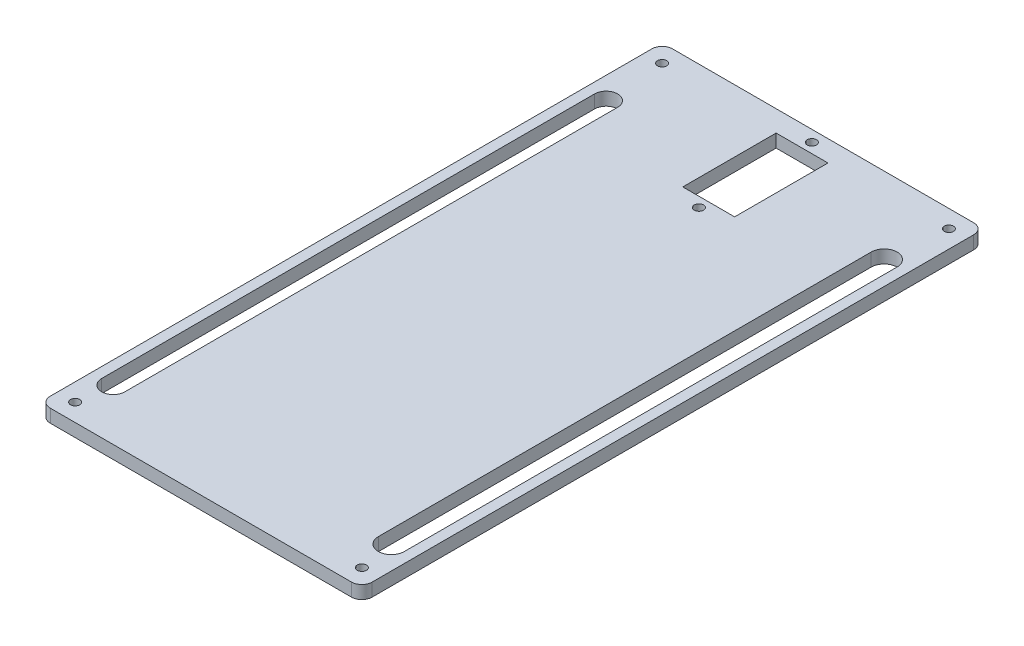
ISO-10303-21;
HEADER;
FILE_DESCRIPTION(('STEP AP214'),'2;1');
FILE_NAME('part.step','',(''),(''),'','','');
FILE_SCHEMA(('AUTOMOTIVE_DESIGN { 1 0 10303 214 1 1 1 1 }'));
ENDSEC;
DATA;
#1=APPLICATION_CONTEXT('core data for automotive mechanical design processes');
#2=APPLICATION_PROTOCOL_DEFINITION('international standard','automotive_design',2000,#1);
#3=PRODUCT_CONTEXT('',#1,'mechanical');
#4=PRODUCT('Part','Part','',(#3));
#5=PRODUCT_RELATED_PRODUCT_CATEGORY('part','',(#4));
#6=PRODUCT_DEFINITION_FORMATION('','',#4);
#7=PRODUCT_DEFINITION_CONTEXT('part definition',#1,'design');
#8=PRODUCT_DEFINITION('design','',#6,#7);
#9=PRODUCT_DEFINITION_SHAPE('','',#8);
#10=(LENGTH_UNIT() NAMED_UNIT(*) SI_UNIT(.MILLI.,.METRE.));
#11=(NAMED_UNIT(*) PLANE_ANGLE_UNIT() SI_UNIT($,.RADIAN.));
#12=(NAMED_UNIT(*) SI_UNIT($,.STERADIAN.) SOLID_ANGLE_UNIT());
#13=UNCERTAINTY_MEASURE_WITH_UNIT(LENGTH_MEASURE(1.E-05),#10,'distance_accuracy_value','');
#14=(GEOMETRIC_REPRESENTATION_CONTEXT(3) GLOBAL_UNCERTAINTY_ASSIGNED_CONTEXT((#13)) GLOBAL_UNIT_ASSIGNED_CONTEXT((#10,
#11,#12)) REPRESENTATION_CONTEXT('',''));
#15=CARTESIAN_POINT('',(0.,0.,0.));
#16=DIRECTION('',(0.,0.,1.));
#17=DIRECTION('',(1.,0.,0.));
#18=AXIS2_PLACEMENT_3D('',#15,#16,#17);
#19=CARTESIAN_POINT('',(-44.45,0.,152.4));
#20=DIRECTION('',(1.,0.,0.));
#21=DIRECTION('',(0.,0.,-1.));
#22=AXIS2_PLACEMENT_3D('',#19,#20,#21);
#23=PLANE('',#22);
#24=DIRECTION('',(0.,0.,-1.));
#25=VECTOR('',#24,1.);
#26=CARTESIAN_POINT('',(-44.45,-3.2004,152.4));
#27=LINE('',#26,#25);
#28=CARTESIAN_POINT('',(-44.45,-3.2004,149.86));
#29=VERTEX_POINT('',#28);
#30=CARTESIAN_POINT('',(-44.45,-3.2004,2.54000000000004));
#31=VERTEX_POINT('',#30);
#32=EDGE_CURVE('E332',#29,#31,#27,.T.);
#33=ORIENTED_EDGE('',*,*,#32,.F.);
#34=DIRECTION('',(0.,-1.,0.));
#35=VECTOR('',#34,1.);
#36=CARTESIAN_POINT('',(-44.45,0.,149.86));
#37=LINE('',#36,#35);
#38=CARTESIAN_POINT('',(-44.45,0.,149.86));
#39=VERTEX_POINT('',#38);
#40=EDGE_CURVE('E59',#29,#39,#37,.F.);
#41=ORIENTED_EDGE('',*,*,#40,.T.);
#42=DIRECTION('',(0.,0.,-1.));
#43=VECTOR('',#42,1.);
#44=CARTESIAN_POINT('',(-44.45,0.,152.4));
#45=LINE('',#44,#43);
#46=CARTESIAN_POINT('',(-44.45,0.,2.54000000000004));
#47=VERTEX_POINT('',#46);
#48=EDGE_CURVE('E320',#39,#47,#45,.T.);
#49=ORIENTED_EDGE('',*,*,#48,.T.);
#50=DIRECTION('',(0.,-1.,0.));
#51=VECTOR('',#50,1.);
#52=CARTESIAN_POINT('',(-44.45,0.,2.53999999999999));
#53=LINE('',#52,#51);
#54=EDGE_CURVE('E360',#47,#31,#53,.T.);
#55=ORIENTED_EDGE('',*,*,#54,.T.);
#56=EDGE_LOOP('',(#33,#41,#49,#55));
#57=FACE_BOUND('',#56,.T.);
#58=ADVANCED_FACE('F37',(#57),#23,.F.);
#59=CARTESIAN_POINT('',(-44.45,-3.2004,152.4));
#60=DIRECTION('',(0.,1.,0.));
#61=DIRECTION('',(-1.,0.,0.));
#62=AXIS2_PLACEMENT_3D('',#59,#60,#61);
#63=PLANE('',#62);
#64=CARTESIAN_POINT('',(-5.02776489999999,-3.2004,2.76528759088731));
#65=DIRECTION('',(0.,-1.,0.));
#66=DIRECTION('',(0.,0.,-1.));
#67=AXIS2_PLACEMENT_3D('',#64,#65,#66);
#68=CIRCLE('',#67,1.1303);
#69=CARTESIAN_POINT('',(-5.02776489999999,-3.2004,1.63498759088731));
#70=VERTEX_POINT('',#69);
#71=EDGE_CURVE('E660',#70,#70,#68,.T.);
#72=ORIENTED_EDGE('',*,*,#71,.F.);
#73=EDGE_LOOP('',(#72));
#74=FACE_BOUND('',#73,.T.);
#75=CARTESIAN_POINT('',(-5.02776490000001,-3.2004,30.4258875908873));
#76=DIRECTION('',(0.,-1.,0.));
#77=DIRECTION('',(0.,0.,-1.));
#78=AXIS2_PLACEMENT_3D('',#75,#76,#77);
#79=CIRCLE('',#78,1.13030000000001);
#80=CARTESIAN_POINT('',(-5.02776490000001,-3.2004,29.2955875908873));
#81=VERTEX_POINT('',#80);
#82=EDGE_CURVE('E206',#81,#81,#79,.T.);
#83=ORIENTED_EDGE('',*,*,#82,.F.);
#84=EDGE_LOOP('',(#83));
#85=FACE_BOUND('',#84,.T.);
#86=DIRECTION('',(0.,0.,-1.));
#87=VECTOR('',#86,1.);
#88=CARTESIAN_POINT('',(-11.3777649,-3.2004,28.0255875908873));
#89=LINE('',#88,#87);
#90=CARTESIAN_POINT('',(-11.3777649,-3.2004,28.0255875908873));
#91=VERTEX_POINT('',#90);
#92=CARTESIAN_POINT('',(-11.3777649,-3.2004,5.16558759088731));
#93=VERTEX_POINT('',#92);
#94=EDGE_CURVE('E212',#91,#93,#89,.T.);
#95=ORIENTED_EDGE('',*,*,#94,.F.);
#96=DIRECTION('',(-1.,0.,0.));
#97=VECTOR('',#96,1.);
#98=CARTESIAN_POINT('',(-11.3777649,-3.2004,28.0255875908873));
#99=LINE('',#98,#97);
#100=CARTESIAN_POINT('',(1.32223510000001,-3.2004,28.0255875908873));
#101=VERTEX_POINT('',#100);
#102=EDGE_CURVE('E182',#101,#91,#99,.T.);
#103=ORIENTED_EDGE('',*,*,#102,.F.);
#104=DIRECTION('',(0.,0.,1.));
#105=VECTOR('',#104,1.);
#106=CARTESIAN_POINT('',(1.32223510000001,-3.2004,28.0255875908873));
#107=LINE('',#106,#105);
#108=CARTESIAN_POINT('',(1.32223510000001,-3.2004,5.16558759088732));
#109=VERTEX_POINT('',#108);
#110=EDGE_CURVE('E200',#109,#101,#107,.T.);
#111=ORIENTED_EDGE('',*,*,#110,.F.);
#112=DIRECTION('',(1.,0.,0.));
#113=VECTOR('',#112,1.);
#114=CARTESIAN_POINT('',(-11.3777649,-3.2004,5.16558759088731));
#115=LINE('',#114,#113);
#116=EDGE_CURVE('E203',#93,#109,#115,.T.);
#117=ORIENTED_EDGE('',*,*,#116,.F.);
#118=EDGE_LOOP('',(#95,#103,#111,#117));
#119=FACE_BOUND('',#118,.T.);
#120=CARTESIAN_POINT('',(30.0764702,-3.2004,4.31799999999999));
#121=DIRECTION('',(0.,-1.,0.));
#122=DIRECTION('',(0.,0.,-1.));
#123=AXIS2_PLACEMENT_3D('',#120,#121,#122);
#124=CIRCLE('',#123,1.1303);
#125=CARTESIAN_POINT('',(30.0764702,-3.2004,3.18769999999999));
#126=VERTEX_POINT('',#125);
#127=EDGE_CURVE('E219',#126,#126,#124,.T.);
#128=ORIENTED_EDGE('',*,*,#127,.F.);
#129=EDGE_LOOP('',(#128));
#130=FACE_BOUND('',#129,.T.);
#131=CARTESIAN_POINT('',(-40.132,-3.2004,4.31799999999999));
#132=DIRECTION('',(0.,-1.,0.));
#133=DIRECTION('',(0.,0.,-1.));
#134=AXIS2_PLACEMENT_3D('',#131,#132,#133);
#135=CIRCLE('',#134,1.13029999999996);
#136=CARTESIAN_POINT('',(-40.132,-3.2004,3.18770000000003));
#137=VERTEX_POINT('',#136);
#138=EDGE_CURVE('E226',#137,#137,#135,.T.);
#139=ORIENTED_EDGE('',*,*,#138,.F.);
#140=EDGE_LOOP('',(#139));
#141=FACE_BOUND('',#140,.T.);
#142=CARTESIAN_POINT('',(30.0764702,-3.2004,148.082));
#143=DIRECTION('',(0.,-1.,0.));
#144=DIRECTION('',(0.,0.,-1.));
#145=AXIS2_PLACEMENT_3D('',#142,#143,#144);
#146=CIRCLE('',#145,1.1303);
#147=CARTESIAN_POINT('',(30.0764702,-3.2004,146.9517));
#148=VERTEX_POINT('',#147);
#149=EDGE_CURVE('E232',#148,#148,#146,.T.);
#150=ORIENTED_EDGE('',*,*,#149,.F.);
#151=EDGE_LOOP('',(#150));
#152=FACE_BOUND('',#151,.T.);
#153=DIRECTION('',(0.,0.,-1.));
#154=VECTOR('',#153,1.);
#155=CARTESIAN_POINT('',(25.5044702,-3.2004,18.7562368469291));
#156=LINE('',#155,#154);
#157=CARTESIAN_POINT('',(25.5044702,-3.2004,139.462865892929));
#158=VERTEX_POINT('',#157);
#159=CARTESIAN_POINT('',(25.5044702000001,-3.2004,18.7562368469291));
#160=VERTEX_POINT('',#159);
#161=EDGE_CURVE('E257',#158,#160,#156,.T.);
#162=ORIENTED_EDGE('',*,*,#161,.F.);
#163=CARTESIAN_POINT('',(28.6794702,-3.2004,139.462865892929));
#164=DIRECTION('',(0.,-1.,0.));
#165=DIRECTION('',(0.,0.,1.));
#166=AXIS2_PLACEMENT_3D('',#163,#164,#165);
#167=CIRCLE('',#166,3.17499999999999);
#168=CARTESIAN_POINT('',(31.8544702,-3.2004,139.462865892929));
#169=VERTEX_POINT('',#168);
#170=EDGE_CURVE('E238',#169,#158,#167,.T.);
#171=ORIENTED_EDGE('',*,*,#170,.F.);
#172=DIRECTION('',(0.,0.,1.));
#173=VECTOR('',#172,1.);
#174=CARTESIAN_POINT('',(31.8544702,-3.2004,18.7562368469291));
#175=LINE('',#174,#173);
#176=CARTESIAN_POINT('',(31.8544702,-3.2004,18.7562368469291));
#177=VERTEX_POINT('',#176);
#178=EDGE_CURVE('E245',#177,#169,#175,.T.);
#179=ORIENTED_EDGE('',*,*,#178,.F.);
#180=CARTESIAN_POINT('',(28.6794702000001,-3.2004,18.7562368469291));
#181=DIRECTION('',(0.,-1.,0.));
#182=DIRECTION('',(0.,0.,1.));
#183=AXIS2_PLACEMENT_3D('',#180,#181,#182);
#184=CIRCLE('',#183,3.175);
#185=EDGE_CURVE('E261',#160,#177,#184,.T.);
#186=ORIENTED_EDGE('',*,*,#185,.F.);
#187=EDGE_LOOP('',(#162,#171,#179,#186));
#188=FACE_BOUND('',#187,.T.);
#189=DIRECTION('',(0.,0.,-1.));
#190=VECTOR('',#189,1.);
#191=CARTESIAN_POINT('',(-41.9100000000002,-3.2004,19.0974123520058));
#192=LINE('',#191,#190);
#193=CARTESIAN_POINT('',(-41.91,-3.2004,139.804041398006));
#194=VERTEX_POINT('',#193);
#195=CARTESIAN_POINT('',(-41.9100000000001,-3.2004,19.0974123520058));
#196=VERTEX_POINT('',#195);
#197=EDGE_CURVE('E290',#194,#196,#192,.T.);
#198=ORIENTED_EDGE('',*,*,#197,.F.);
#199=CARTESIAN_POINT('',(-39.0761755050767,-3.2004,139.804041398006));
#200=DIRECTION('',(0.,-1.,0.));
#201=DIRECTION('',(0.,0.,1.));
#202=AXIS2_PLACEMENT_3D('',#199,#200,#201);
#203=CIRCLE('',#202,2.83382449492334);
#204=CARTESIAN_POINT('',(-36.2423510101533,-3.2004,139.804041398006));
#205=VERTEX_POINT('',#204);
#206=EDGE_CURVE('E268',#205,#194,#203,.T.);
#207=ORIENTED_EDGE('',*,*,#206,.F.);
#208=DIRECTION('',(0.,0.,1.));
#209=VECTOR('',#208,1.);
#210=CARTESIAN_POINT('',(-36.2423510101535,-3.2004,19.0974123520058));
#211=LINE('',#210,#209);
#212=CARTESIAN_POINT('',(-36.2423510101535,-3.2004,19.0974123520058));
#213=VERTEX_POINT('',#212);
#214=EDGE_CURVE('E279',#213,#205,#211,.T.);
#215=ORIENTED_EDGE('',*,*,#214,.F.);
#216=CARTESIAN_POINT('',(-39.0761755050767,-3.2004,19.0974123520058));
#217=DIRECTION('',(0.,-1.,0.));
#218=DIRECTION('',(0.,0.,1.));
#219=AXIS2_PLACEMENT_3D('',#216,#217,#218);
#220=CIRCLE('',#219,2.83382449492335);
#221=EDGE_CURVE('E293',#196,#213,#220,.T.);
#222=ORIENTED_EDGE('',*,*,#221,.F.);
#223=EDGE_LOOP('',(#198,#207,#215,#222));
#224=FACE_BOUND('',#223,.T.);
#225=CARTESIAN_POINT('',(-40.132,-3.2004,148.082));
#226=DIRECTION('',(0.,-1.,0.));
#227=DIRECTION('',(0.,0.,-1.));
#228=AXIS2_PLACEMENT_3D('',#225,#226,#227);
#229=CIRCLE('',#228,1.13030000000002);
#230=CARTESIAN_POINT('',(-40.132,-3.2004,146.9517));
#231=VERTEX_POINT('',#230);
#232=EDGE_CURVE('E300',#231,#231,#229,.T.);
#233=ORIENTED_EDGE('',*,*,#232,.F.);
#234=EDGE_LOOP('',(#233));
#235=FACE_BOUND('',#234,.T.);
#236=DIRECTION('',(0.,0.,-1.));
#237=VECTOR('',#236,1.);
#238=CARTESIAN_POINT('',(34.3944702,-3.2004,152.4));
#239=LINE('',#238,#237);
#240=CARTESIAN_POINT('',(34.3944702,-3.2004,149.86));
#241=VERTEX_POINT('',#240);
#242=CARTESIAN_POINT('',(34.3944702,-3.2004,2.54000000000004));
#243=VERTEX_POINT('',#242);
#244=EDGE_CURVE('E329',#241,#243,#239,.T.);
#245=ORIENTED_EDGE('',*,*,#244,.F.);
#246=CARTESIAN_POINT('',(31.8544702,-3.2004,149.86));
#247=DIRECTION('',(0.,1.,0.));
#248=DIRECTION('',(-1.,0.,0.));
#249=AXIS2_PLACEMENT_3D('',#246,#247,#248);
#250=CIRCLE('',#249,2.54);
#251=CARTESIAN_POINT('',(31.8544702,-3.2004,152.4));
#252=VERTEX_POINT('',#251);
#253=EDGE_CURVE('E346',#241,#252,#250,.F.);
#254=ORIENTED_EDGE('',*,*,#253,.T.);
#255=DIRECTION('',(1.,0.,0.));
#256=VECTOR('',#255,1.);
#257=CARTESIAN_POINT('',(-44.45,-3.2004,152.4));
#258=LINE('',#257,#256);
#259=CARTESIAN_POINT('',(-41.91,-3.2004,152.4));
#260=VERTEX_POINT('',#259);
#261=EDGE_CURVE('E313',#260,#252,#258,.T.);
#262=ORIENTED_EDGE('',*,*,#261,.F.);
#263=CARTESIAN_POINT('',(-41.91,-3.2004,149.86));
#264=DIRECTION('',(0.,1.,0.));
#265=DIRECTION('',(-1.,0.,0.));
#266=AXIS2_PLACEMENT_3D('',#263,#264,#265);
#267=CIRCLE('',#266,2.54);
#268=EDGE_CURVE('E344',#260,#29,#267,.F.);
#269=ORIENTED_EDGE('',*,*,#268,.T.);
#270=ORIENTED_EDGE('',*,*,#32,.T.);
#271=CARTESIAN_POINT('',(-41.91,-3.2004,2.53999999999999));
#272=DIRECTION('',(0.,1.,0.));
#273=DIRECTION('',(-1.,0.,0.));
#274=AXIS2_PLACEMENT_3D('',#271,#272,#273);
#275=CIRCLE('',#274,2.54);
#276=CARTESIAN_POINT('',(-41.91,-3.2004,0.));
#277=VERTEX_POINT('',#276);
#278=EDGE_CURVE('E342',#31,#277,#275,.F.);
#279=ORIENTED_EDGE('',*,*,#278,.T.);
#280=DIRECTION('',(1.,0.,0.));
#281=VECTOR('',#280,1.);
#282=CARTESIAN_POINT('',(-44.45,-3.2004,0.));
#283=LINE('',#282,#281);
#284=CARTESIAN_POINT('',(31.8544702,-3.2004,0.));
#285=VERTEX_POINT('',#284);
#286=EDGE_CURVE('E310',#277,#285,#283,.T.);
#287=ORIENTED_EDGE('',*,*,#286,.T.);
#288=CARTESIAN_POINT('',(31.8544702,-3.2004,2.54));
#289=DIRECTION('',(0.,1.,0.));
#290=DIRECTION('',(-1.,0.,0.));
#291=AXIS2_PLACEMENT_3D('',#288,#289,#290);
#292=CIRCLE('',#291,2.54);
#293=EDGE_CURVE('E340',#285,#243,#292,.F.);
#294=ORIENTED_EDGE('',*,*,#293,.T.);
#295=EDGE_LOOP('',(#245,#254,#262,#269,#270,#279,#287,#294));
#296=FACE_BOUND('',#295,.T.);
#297=ADVANCED_FACE('F373',(#74,#85,#119,#130,#141,#152,#188,#224,#235,#296),#63,.F.);
#298=CARTESIAN_POINT('',(34.3944702,0.,152.4));
#299=DIRECTION('',(1.,0.,0.));
#300=DIRECTION('',(0.,0.,-1.));
#301=AXIS2_PLACEMENT_3D('',#298,#299,#300);
#302=PLANE('',#301);
#303=DIRECTION('',(0.,0.,-1.));
#304=VECTOR('',#303,1.);
#305=CARTESIAN_POINT('',(34.3944702,0.,152.4));
#306=LINE('',#305,#304);
#307=CARTESIAN_POINT('',(34.3944702,0.,149.86));
#308=VERTEX_POINT('',#307);
#309=CARTESIAN_POINT('',(34.3944702,0.,2.54000000000004));
#310=VERTEX_POINT('',#309);
#311=EDGE_CURVE('E326',#308,#310,#306,.T.);
#312=ORIENTED_EDGE('',*,*,#311,.F.);
#313=DIRECTION('',(0.,-1.,0.));
#314=VECTOR('',#313,1.);
#315=CARTESIAN_POINT('',(34.3944702,0.,149.86));
#316=LINE('',#315,#314);
#317=EDGE_CURVE('E337',#308,#241,#316,.T.);
#318=ORIENTED_EDGE('',*,*,#317,.T.);
#319=ORIENTED_EDGE('',*,*,#244,.T.);
#320=DIRECTION('',(0.,-1.,0.));
#321=VECTOR('',#320,1.);
#322=CARTESIAN_POINT('',(34.3944702,0.,2.54));
#323=LINE('',#322,#321);
#324=EDGE_CURVE('E335',#243,#310,#323,.F.);
#325=ORIENTED_EDGE('',*,*,#324,.T.);
#326=EDGE_LOOP('',(#312,#318,#319,#325));
#327=FACE_BOUND('',#326,.T.);
#328=ADVANCED_FACE('F392',(#327),#302,.T.);
#329=CARTESIAN_POINT('',(-44.45,0.,152.4));
#330=DIRECTION('',(0.,1.,0.));
#331=DIRECTION('',(0.,0.,1.));
#332=AXIS2_PLACEMENT_3D('',#329,#330,#331);
#333=PLANE('',#332);
#334=CARTESIAN_POINT('',(-5.02776489999999,0.,2.76528759088731));
#335=DIRECTION('',(0.,-1.,0.));
#336=DIRECTION('',(0.,0.,-1.));
#337=AXIS2_PLACEMENT_3D('',#334,#335,#336);
#338=CIRCLE('',#337,1.1303);
#339=CARTESIAN_POINT('',(-5.02776489999999,0.,1.63498759088731));
#340=VERTEX_POINT('',#339);
#341=EDGE_CURVE('E655',#340,#340,#338,.T.);
#342=ORIENTED_EDGE('',*,*,#341,.T.);
#343=EDGE_LOOP('',(#342));
#344=FACE_BOUND('',#343,.T.);
#345=CARTESIAN_POINT('',(-5.02776490000001,0.,30.4258875908873));
#346=DIRECTION('',(0.,-1.,0.));
#347=DIRECTION('',(0.,0.,-1.));
#348=AXIS2_PLACEMENT_3D('',#345,#346,#347);
#349=CIRCLE('',#348,1.13030000000001);
#350=CARTESIAN_POINT('',(-5.02776490000001,0.,29.2955875908873));
#351=VERTEX_POINT('',#350);
#352=EDGE_CURVE('E213',#351,#351,#349,.T.);
#353=ORIENTED_EDGE('',*,*,#352,.T.);
#354=EDGE_LOOP('',(#353));
#355=FACE_BOUND('',#354,.T.);
#356=DIRECTION('',(-1.,0.,0.));
#357=VECTOR('',#356,1.);
#358=CARTESIAN_POINT('',(-11.3777649,0.,28.0255875908873));
#359=LINE('',#358,#357);
#360=CARTESIAN_POINT('',(1.32223510000001,0.,28.0255875908873));
#361=VERTEX_POINT('',#360);
#362=CARTESIAN_POINT('',(-11.3777649,0.,28.0255875908873));
#363=VERTEX_POINT('',#362);
#364=EDGE_CURVE('E179',#361,#363,#359,.T.);
#365=ORIENTED_EDGE('',*,*,#364,.T.);
#366=DIRECTION('',(0.,0.,-1.));
#367=VECTOR('',#366,1.);
#368=CARTESIAN_POINT('',(-11.3777649,0.,28.0255875908873));
#369=LINE('',#368,#367);
#370=CARTESIAN_POINT('',(-11.3777649,0.,5.16558759088731));
#371=VERTEX_POINT('',#370);
#372=EDGE_CURVE('E191',#363,#371,#369,.T.);
#373=ORIENTED_EDGE('',*,*,#372,.T.);
#374=DIRECTION('',(1.,0.,0.));
#375=VECTOR('',#374,1.);
#376=CARTESIAN_POINT('',(-11.3777649,0.,5.16558759088731));
#377=LINE('',#376,#375);
#378=CARTESIAN_POINT('',(1.32223510000001,0.,5.16558759088732));
#379=VERTEX_POINT('',#378);
#380=EDGE_CURVE('E195',#371,#379,#377,.T.);
#381=ORIENTED_EDGE('',*,*,#380,.T.);
#382=DIRECTION('',(0.,0.,1.));
#383=VECTOR('',#382,1.);
#384=CARTESIAN_POINT('',(1.32223510000001,0.,28.0255875908873));
#385=LINE('',#384,#383);
#386=EDGE_CURVE('E187',#379,#361,#385,.T.);
#387=ORIENTED_EDGE('',*,*,#386,.T.);
#388=EDGE_LOOP('',(#365,#373,#381,#387));
#389=FACE_BOUND('',#388,.T.);
#390=CARTESIAN_POINT('',(30.0764702,0.,4.31799999999999));
#391=DIRECTION('',(0.,-1.,0.));
#392=DIRECTION('',(0.,0.,-1.));
#393=AXIS2_PLACEMENT_3D('',#390,#391,#392);
#394=CIRCLE('',#393,1.1303);
#395=CARTESIAN_POINT('',(30.0764702,0.,3.18769999999999));
#396=VERTEX_POINT('',#395);
#397=EDGE_CURVE('E223',#396,#396,#394,.T.);
#398=ORIENTED_EDGE('',*,*,#397,.T.);
#399=EDGE_LOOP('',(#398));
#400=FACE_BOUND('',#399,.T.);
#401=CARTESIAN_POINT('',(-40.132,0.,4.31799999999999));
#402=DIRECTION('',(0.,-1.,0.));
#403=DIRECTION('',(0.,0.,-1.));
#404=AXIS2_PLACEMENT_3D('',#401,#402,#403);
#405=CIRCLE('',#404,1.13029999999996);
#406=CARTESIAN_POINT('',(-40.132,0.,3.18770000000003));
#407=VERTEX_POINT('',#406);
#408=EDGE_CURVE('E229',#407,#407,#405,.T.);
#409=ORIENTED_EDGE('',*,*,#408,.T.);
#410=EDGE_LOOP('',(#409));
#411=FACE_BOUND('',#410,.T.);
#412=CARTESIAN_POINT('',(30.0764702,0.,148.082));
#413=DIRECTION('',(0.,-1.,0.));
#414=DIRECTION('',(0.,0.,-1.));
#415=AXIS2_PLACEMENT_3D('',#412,#413,#414);
#416=CIRCLE('',#415,1.1303);
#417=CARTESIAN_POINT('',(30.0764702,0.,146.9517));
#418=VERTEX_POINT('',#417);
#419=EDGE_CURVE('E235',#418,#418,#416,.T.);
#420=ORIENTED_EDGE('',*,*,#419,.T.);
#421=EDGE_LOOP('',(#420));
#422=FACE_BOUND('',#421,.T.);
#423=CARTESIAN_POINT('',(28.6794702,0.,139.462865892929));
#424=DIRECTION('',(0.,-1.,0.));
#425=DIRECTION('',(0.,0.,1.));
#426=AXIS2_PLACEMENT_3D('',#423,#424,#425);
#427=CIRCLE('',#426,3.17499999999999);
#428=CARTESIAN_POINT('',(31.8544702,0.,139.462865892929));
#429=VERTEX_POINT('',#428);
#430=CARTESIAN_POINT('',(25.5044702000001,0.,139.462865892929));
#431=VERTEX_POINT('',#430);
#432=EDGE_CURVE('E241',#429,#431,#427,.T.);
#433=ORIENTED_EDGE('',*,*,#432,.T.);
#434=DIRECTION('',(0.,0.,-1.));
#435=VECTOR('',#434,1.);
#436=CARTESIAN_POINT('',(25.5044702,0.,18.7562368469291));
#437=LINE('',#436,#435);
#438=CARTESIAN_POINT('',(25.5044702,0.,18.7562368469291));
#439=VERTEX_POINT('',#438);
#440=EDGE_CURVE('E244',#431,#439,#437,.T.);
#441=ORIENTED_EDGE('',*,*,#440,.T.);
#442=CARTESIAN_POINT('',(28.6794702000001,0.,18.7562368469291));
#443=DIRECTION('',(0.,-1.,0.));
#444=DIRECTION('',(0.,0.,1.));
#445=AXIS2_PLACEMENT_3D('',#442,#443,#444);
#446=CIRCLE('',#445,3.175);
#447=CARTESIAN_POINT('',(31.8544702,0.,18.7562368469291));
#448=VERTEX_POINT('',#447);
#449=EDGE_CURVE('E249',#439,#448,#446,.T.);
#450=ORIENTED_EDGE('',*,*,#449,.T.);
#451=DIRECTION('',(0.,0.,1.));
#452=VECTOR('',#451,1.);
#453=CARTESIAN_POINT('',(31.8544702,0.,18.7562368469291));
#454=LINE('',#453,#452);
#455=EDGE_CURVE('E252',#448,#429,#454,.T.);
#456=ORIENTED_EDGE('',*,*,#455,.T.);
#457=EDGE_LOOP('',(#433,#441,#450,#456));
#458=FACE_BOUND('',#457,.T.);
#459=CARTESIAN_POINT('',(-39.0761755050767,0.,139.804041398006));
#460=DIRECTION('',(0.,-1.,0.));
#461=DIRECTION('',(0.,0.,1.));
#462=AXIS2_PLACEMENT_3D('',#459,#460,#461);
#463=CIRCLE('',#462,2.83382449492334);
#464=CARTESIAN_POINT('',(-36.2423510101533,0.,139.804041398006));
#465=VERTEX_POINT('',#464);
#466=CARTESIAN_POINT('',(-41.91,0.,139.804041398006));
#467=VERTEX_POINT('',#466);
#468=EDGE_CURVE('E275',#465,#467,#463,.T.);
#469=ORIENTED_EDGE('',*,*,#468,.T.);
#470=DIRECTION('',(0.,0.,-1.));
#471=VECTOR('',#470,1.);
#472=CARTESIAN_POINT('',(-41.9100000000002,0.,19.0974123520058));
#473=LINE('',#472,#471);
#474=CARTESIAN_POINT('',(-41.9100000000002,0.,19.0974123520058));
#475=VERTEX_POINT('',#474);
#476=EDGE_CURVE('E278',#467,#475,#473,.T.);
#477=ORIENTED_EDGE('',*,*,#476,.T.);
#478=CARTESIAN_POINT('',(-39.0761755050767,0.,19.0974123520058));
#479=DIRECTION('',(0.,-1.,0.));
#480=DIRECTION('',(0.,0.,1.));
#481=AXIS2_PLACEMENT_3D('',#478,#479,#480);
#482=CIRCLE('',#481,2.83382449492335);
#483=CARTESIAN_POINT('',(-36.2423510101535,0.,19.0974123520058));
#484=VERTEX_POINT('',#483);
#485=EDGE_CURVE('E282',#475,#484,#482,.T.);
#486=ORIENTED_EDGE('',*,*,#485,.T.);
#487=DIRECTION('',(0.,0.,1.));
#488=VECTOR('',#487,1.);
#489=CARTESIAN_POINT('',(-36.2423510101535,0.,19.0974123520058));
#490=LINE('',#489,#488);
#491=EDGE_CURVE('E285',#484,#465,#490,.T.);
#492=ORIENTED_EDGE('',*,*,#491,.T.);
#493=EDGE_LOOP('',(#469,#477,#486,#492));
#494=FACE_BOUND('',#493,.T.);
#495=CARTESIAN_POINT('',(-40.132,0.,148.082));
#496=DIRECTION('',(0.,-1.,0.));
#497=DIRECTION('',(0.,0.,-1.));
#498=AXIS2_PLACEMENT_3D('',#495,#496,#497);
#499=CIRCLE('',#498,1.13030000000002);
#500=CARTESIAN_POINT('',(-40.132,0.,146.9517));
#501=VERTEX_POINT('',#500);
#502=EDGE_CURVE('E307',#501,#501,#499,.T.);
#503=ORIENTED_EDGE('',*,*,#502,.T.);
#504=EDGE_LOOP('',(#503));
#505=FACE_BOUND('',#504,.T.);
#506=DIRECTION('',(1.,0.,0.));
#507=VECTOR('',#506,1.);
#508=CARTESIAN_POINT('',(-44.45,0.,152.4));
#509=LINE('',#508,#507);
#510=CARTESIAN_POINT('',(-41.91,0.,152.4));
#511=VERTEX_POINT('',#510);
#512=CARTESIAN_POINT('',(31.8544702,0.,152.4));
#513=VERTEX_POINT('',#512);
#514=EDGE_CURVE('E316',#511,#513,#509,.T.);
#515=ORIENTED_EDGE('',*,*,#514,.T.);
#516=CARTESIAN_POINT('',(31.8544702,0.,149.86));
#517=DIRECTION('',(0.,1.,0.));
#518=DIRECTION('',(0.,0.,1.));
#519=AXIS2_PLACEMENT_3D('',#516,#517,#518);
#520=CIRCLE('',#519,2.54);
#521=EDGE_CURVE('E358',#513,#308,#520,.T.);
#522=ORIENTED_EDGE('',*,*,#521,.T.);
#523=ORIENTED_EDGE('',*,*,#311,.T.);
#524=CARTESIAN_POINT('',(31.8544702,0.,2.54));
#525=DIRECTION('',(0.,1.,0.));
#526=DIRECTION('',(0.,0.,1.));
#527=AXIS2_PLACEMENT_3D('',#524,#525,#526);
#528=CIRCLE('',#527,2.54);
#529=CARTESIAN_POINT('',(31.8544702,0.,0.));
#530=VERTEX_POINT('',#529);
#531=EDGE_CURVE('E353',#310,#530,#528,.T.);
#532=ORIENTED_EDGE('',*,*,#531,.T.);
#533=DIRECTION('',(1.,0.,0.));
#534=VECTOR('',#533,1.);
#535=CARTESIAN_POINT('',(-44.45,0.,0.));
#536=LINE('',#535,#534);
#537=CARTESIAN_POINT('',(-41.91,0.,0.));
#538=VERTEX_POINT('',#537);
#539=EDGE_CURVE('E317',#538,#530,#536,.T.);
#540=ORIENTED_EDGE('',*,*,#539,.F.);
#541=CARTESIAN_POINT('',(-41.91,0.,2.53999999999999));
#542=DIRECTION('',(0.,1.,0.));
#543=DIRECTION('',(0.,0.,1.));
#544=AXIS2_PLACEMENT_3D('',#541,#542,#543);
#545=CIRCLE('',#544,2.54);
#546=EDGE_CURVE('E52',#538,#47,#545,.T.);
#547=ORIENTED_EDGE('',*,*,#546,.T.);
#548=ORIENTED_EDGE('',*,*,#48,.F.);
#549=CARTESIAN_POINT('',(-41.91,0.,149.86));
#550=DIRECTION('',(0.,1.,0.));
#551=DIRECTION('',(0.,0.,1.));
#552=AXIS2_PLACEMENT_3D('',#549,#550,#551);
#553=CIRCLE('',#552,2.54);
#554=EDGE_CURVE('E356',#39,#511,#553,.T.);
#555=ORIENTED_EDGE('',*,*,#554,.T.);
#556=EDGE_LOOP('',(#515,#522,#523,#532,#540,#547,#548,#555));
#557=FACE_BOUND('',#556,.T.);
#558=ADVANCED_FACE('F197',(#344,#355,#389,#400,#411,#422,#458,#494,#505,#557),#333,.T.);
#559=CARTESIAN_POINT('',(0.,0.,152.4));
#560=DIRECTION('',(0.,0.,1.));
#561=DIRECTION('',(1.,0.,0.));
#562=AXIS2_PLACEMENT_3D('',#559,#560,#561);
#563=PLANE('',#562);
#564=ORIENTED_EDGE('',*,*,#261,.T.);
#565=DIRECTION('',(0.,-1.,0.));
#566=VECTOR('',#565,1.);
#567=CARTESIAN_POINT('',(31.8544702,0.,152.4));
#568=LINE('',#567,#566);
#569=EDGE_CURVE('E351',#252,#513,#568,.F.);
#570=ORIENTED_EDGE('',*,*,#569,.T.);
#571=ORIENTED_EDGE('',*,*,#514,.F.);
#572=DIRECTION('',(0.,-1.,0.));
#573=VECTOR('',#572,1.);
#574=CARTESIAN_POINT('',(-41.91,-3.2004,152.4));
#575=LINE('',#574,#573);
#576=EDGE_CURVE('E348',#511,#260,#575,.T.);
#577=ORIENTED_EDGE('',*,*,#576,.T.);
#578=EDGE_LOOP('',(#564,#570,#571,#577));
#579=FACE_BOUND('',#578,.T.);
#580=ADVANCED_FACE('F384',(#579),#563,.T.);
#581=CARTESIAN_POINT('',(0.,0.,0.));
#582=DIRECTION('',(0.,0.,1.));
#583=DIRECTION('',(1.,0.,0.));
#584=AXIS2_PLACEMENT_3D('',#581,#582,#583);
#585=PLANE('',#584);
#586=ORIENTED_EDGE('',*,*,#286,.F.);
#587=DIRECTION('',(0.,-1.,0.));
#588=VECTOR('',#587,1.);
#589=CARTESIAN_POINT('',(-41.91,0.,0.));
#590=LINE('',#589,#588);
#591=EDGE_CURVE('E11',#277,#538,#590,.F.);
#592=ORIENTED_EDGE('',*,*,#591,.T.);
#593=ORIENTED_EDGE('',*,*,#539,.T.);
#594=DIRECTION('',(0.,-1.,0.));
#595=VECTOR('',#594,1.);
#596=CARTESIAN_POINT('',(31.8544702,-3.2004,0.));
#597=LINE('',#596,#595);
#598=EDGE_CURVE('E45',#530,#285,#597,.T.);
#599=ORIENTED_EDGE('',*,*,#598,.T.);
#600=EDGE_LOOP('',(#586,#592,#593,#599));
#601=FACE_BOUND('',#600,.T.);
#602=ADVANCED_FACE('F367',(#601),#585,.F.);
#603=CARTESIAN_POINT('',(-40.132,0.,148.082));
#604=DIRECTION('',(0.,-1.,0.));
#605=DIRECTION('',(0.,0.,-1.));
#606=AXIS2_PLACEMENT_3D('',#603,#604,#605);
#607=CYLINDRICAL_SURFACE('',#606,1.13030000000002);
#608=ORIENTED_EDGE('',*,*,#502,.F.);
#609=EDGE_LOOP('',(#608));
#610=FACE_BOUND('',#609,.T.);
#611=ORIENTED_EDGE('',*,*,#232,.T.);
#612=EDGE_LOOP('',(#611));
#613=FACE_BOUND('',#612,.T.);
#614=ADVANCED_FACE('F580',(#610,#613),#607,.F.);
#615=CARTESIAN_POINT('',(-39.0761755050767,0.,139.804041398006));
#616=DIRECTION('',(0.,-1.,0.));
#617=DIRECTION('',(0.,0.,-1.));
#618=AXIS2_PLACEMENT_3D('',#615,#616,#617);
#619=CYLINDRICAL_SURFACE('',#618,2.83382449492334);
#620=ORIENTED_EDGE('',*,*,#206,.T.);
#621=DIRECTION('',(0.,-1.,0.));
#622=VECTOR('',#621,1.);
#623=CARTESIAN_POINT('',(-41.91,0.,139.804041398006));
#624=LINE('',#623,#622);
#625=EDGE_CURVE('E288',#467,#194,#624,.T.);
#626=ORIENTED_EDGE('',*,*,#625,.F.);
#627=ORIENTED_EDGE('',*,*,#468,.F.);
#628=DIRECTION('',(0.,-1.,0.));
#629=VECTOR('',#628,1.);
#630=CARTESIAN_POINT('',(-36.2423510101533,0.,139.804041398006));
#631=LINE('',#630,#629);
#632=EDGE_CURVE('E298',#465,#205,#631,.T.);
#633=ORIENTED_EDGE('',*,*,#632,.T.);
#634=EDGE_LOOP('',(#620,#626,#627,#633));
#635=FACE_BOUND('',#634,.T.);
#636=ADVANCED_FACE('F571',(#635),#619,.F.);
#637=CARTESIAN_POINT('',(-36.2423510101535,0.,19.0974123520058));
#638=DIRECTION('',(1.,0.,0.));
#639=DIRECTION('',(0.,0.,-1.));
#640=AXIS2_PLACEMENT_3D('',#637,#638,#639);
#641=PLANE('',#640);
#642=ORIENTED_EDGE('',*,*,#214,.T.);
#643=ORIENTED_EDGE('',*,*,#632,.F.);
#644=ORIENTED_EDGE('',*,*,#491,.F.);
#645=DIRECTION('',(0.,-1.,0.));
#646=VECTOR('',#645,1.);
#647=CARTESIAN_POINT('',(-36.2423510101535,0.,19.0974123520058));
#648=LINE('',#647,#646);
#649=EDGE_CURVE('E301',#484,#213,#648,.T.);
#650=ORIENTED_EDGE('',*,*,#649,.T.);
#651=EDGE_LOOP('',(#642,#643,#644,#650));
#652=FACE_BOUND('',#651,.T.);
#653=ADVANCED_FACE('F562',(#652),#641,.F.);
#654=CARTESIAN_POINT('',(-39.0761755050767,0.,19.0974123520058));
#655=DIRECTION('',(0.,-1.,0.));
#656=DIRECTION('',(0.,0.,-1.));
#657=AXIS2_PLACEMENT_3D('',#654,#655,#656);
#658=CYLINDRICAL_SURFACE('',#657,2.83382449492335);
#659=ORIENTED_EDGE('',*,*,#221,.T.);
#660=ORIENTED_EDGE('',*,*,#649,.F.);
#661=ORIENTED_EDGE('',*,*,#485,.F.);
#662=DIRECTION('',(0.,-1.,0.));
#663=VECTOR('',#662,1.);
#664=CARTESIAN_POINT('',(-41.9100000000001,0.,19.0974123520058));
#665=LINE('',#664,#663);
#666=EDGE_CURVE('E303',#475,#196,#665,.T.);
#667=ORIENTED_EDGE('',*,*,#666,.T.);
#668=EDGE_LOOP('',(#659,#660,#661,#667));
#669=FACE_BOUND('',#668,.T.);
#670=ADVANCED_FACE('F553',(#669),#658,.F.);
#671=CARTESIAN_POINT('',(-41.9100000000002,0.,19.0974123520058));
#672=DIRECTION('',(-1.,0.,0.));
#673=DIRECTION('',(0.,0.,1.));
#674=AXIS2_PLACEMENT_3D('',#671,#672,#673);
#675=PLANE('',#674);
#676=ORIENTED_EDGE('',*,*,#197,.T.);
#677=ORIENTED_EDGE('',*,*,#666,.F.);
#678=ORIENTED_EDGE('',*,*,#476,.F.);
#679=ORIENTED_EDGE('',*,*,#625,.T.);
#680=EDGE_LOOP('',(#676,#677,#678,#679));
#681=FACE_BOUND('',#680,.T.);
#682=ADVANCED_FACE('F544',(#681),#675,.F.);
#683=CARTESIAN_POINT('',(28.6794702,0.,139.462865892929));
#684=DIRECTION('',(0.,-1.,0.));
#685=DIRECTION('',(0.,0.,-1.));
#686=AXIS2_PLACEMENT_3D('',#683,#684,#685);
#687=CYLINDRICAL_SURFACE('',#686,3.17499999999999);
#688=ORIENTED_EDGE('',*,*,#170,.T.);
#689=DIRECTION('',(0.,-1.,0.));
#690=VECTOR('',#689,1.);
#691=CARTESIAN_POINT('',(25.5044702000001,0.,139.462865892929));
#692=LINE('',#691,#690);
#693=EDGE_CURVE('E255',#431,#158,#692,.T.);
#694=ORIENTED_EDGE('',*,*,#693,.F.);
#695=ORIENTED_EDGE('',*,*,#432,.F.);
#696=DIRECTION('',(0.,-1.,0.));
#697=VECTOR('',#696,1.);
#698=CARTESIAN_POINT('',(31.8544702,0.,139.462865892929));
#699=LINE('',#698,#697);
#700=EDGE_CURVE('E266',#429,#169,#699,.T.);
#701=ORIENTED_EDGE('',*,*,#700,.T.);
#702=EDGE_LOOP('',(#688,#694,#695,#701));
#703=FACE_BOUND('',#702,.T.);
#704=ADVANCED_FACE('F535',(#703),#687,.F.);
#705=CARTESIAN_POINT('',(31.8544702,0.,18.7562368469291));
#706=DIRECTION('',(1.,0.,0.));
#707=DIRECTION('',(0.,0.,-1.));
#708=AXIS2_PLACEMENT_3D('',#705,#706,#707);
#709=PLANE('',#708);
#710=ORIENTED_EDGE('',*,*,#178,.T.);
#711=ORIENTED_EDGE('',*,*,#700,.F.);
#712=ORIENTED_EDGE('',*,*,#455,.F.);
#713=DIRECTION('',(0.,-1.,0.));
#714=VECTOR('',#713,1.);
#715=CARTESIAN_POINT('',(31.8544702,0.,18.7562368469291));
#716=LINE('',#715,#714);
#717=EDGE_CURVE('E269',#448,#177,#716,.T.);
#718=ORIENTED_EDGE('',*,*,#717,.T.);
#719=EDGE_LOOP('',(#710,#711,#712,#718));
#720=FACE_BOUND('',#719,.T.);
#721=ADVANCED_FACE('F526',(#720),#709,.F.);
#722=CARTESIAN_POINT('',(28.6794702000001,0.,18.7562368469291));
#723=DIRECTION('',(0.,-1.,0.));
#724=DIRECTION('',(0.,0.,-1.));
#725=AXIS2_PLACEMENT_3D('',#722,#723,#724);
#726=CYLINDRICAL_SURFACE('',#725,3.175);
#727=ORIENTED_EDGE('',*,*,#185,.T.);
#728=ORIENTED_EDGE('',*,*,#717,.F.);
#729=ORIENTED_EDGE('',*,*,#449,.F.);
#730=DIRECTION('',(0.,-1.,0.));
#731=VECTOR('',#730,1.);
#732=CARTESIAN_POINT('',(25.5044702000001,0.,18.7562368469291));
#733=LINE('',#732,#731);
#734=EDGE_CURVE('E271',#439,#160,#733,.T.);
#735=ORIENTED_EDGE('',*,*,#734,.T.);
#736=EDGE_LOOP('',(#727,#728,#729,#735));
#737=FACE_BOUND('',#736,.T.);
#738=ADVANCED_FACE('F517',(#737),#726,.F.);
#739=CARTESIAN_POINT('',(25.5044702,0.,18.7562368469291));
#740=DIRECTION('',(-1.,0.,0.));
#741=DIRECTION('',(0.,0.,1.));
#742=AXIS2_PLACEMENT_3D('',#739,#740,#741);
#743=PLANE('',#742);
#744=ORIENTED_EDGE('',*,*,#161,.T.);
#745=ORIENTED_EDGE('',*,*,#734,.F.);
#746=ORIENTED_EDGE('',*,*,#440,.F.);
#747=ORIENTED_EDGE('',*,*,#693,.T.);
#748=EDGE_LOOP('',(#744,#745,#746,#747));
#749=FACE_BOUND('',#748,.T.);
#750=ADVANCED_FACE('F508',(#749),#743,.F.);
#751=CARTESIAN_POINT('',(30.0764702,0.,148.082));
#752=DIRECTION('',(0.,-1.,0.));
#753=DIRECTION('',(0.,0.,-1.));
#754=AXIS2_PLACEMENT_3D('',#751,#752,#753);
#755=CYLINDRICAL_SURFACE('',#754,1.1303);
#756=ORIENTED_EDGE('',*,*,#419,.F.);
#757=EDGE_LOOP('',(#756));
#758=FACE_BOUND('',#757,.T.);
#759=ORIENTED_EDGE('',*,*,#149,.T.);
#760=EDGE_LOOP('',(#759));
#761=FACE_BOUND('',#760,.T.);
#762=ADVANCED_FACE('F499',(#758,#761),#755,.F.);
#763=CARTESIAN_POINT('',(-40.132,0.,4.31799999999999));
#764=DIRECTION('',(0.,-1.,0.));
#765=DIRECTION('',(0.,0.,-1.));
#766=AXIS2_PLACEMENT_3D('',#763,#764,#765);
#767=CYLINDRICAL_SURFACE('',#766,1.13029999999996);
#768=ORIENTED_EDGE('',*,*,#408,.F.);
#769=EDGE_LOOP('',(#768));
#770=FACE_BOUND('',#769,.T.);
#771=ORIENTED_EDGE('',*,*,#138,.T.);
#772=EDGE_LOOP('',(#771));
#773=FACE_BOUND('',#772,.T.);
#774=ADVANCED_FACE('F490',(#770,#773),#767,.F.);
#775=CARTESIAN_POINT('',(30.0764702,0.,4.31799999999999));
#776=DIRECTION('',(0.,-1.,0.));
#777=DIRECTION('',(0.,0.,-1.));
#778=AXIS2_PLACEMENT_3D('',#775,#776,#777);
#779=CYLINDRICAL_SURFACE('',#778,1.1303);
#780=ORIENTED_EDGE('',*,*,#397,.F.);
#781=EDGE_LOOP('',(#780));
#782=FACE_BOUND('',#781,.T.);
#783=ORIENTED_EDGE('',*,*,#127,.T.);
#784=EDGE_LOOP('',(#783));
#785=FACE_BOUND('',#784,.T.);
#786=ADVANCED_FACE('F482',(#782,#785),#779,.F.);
#787=CARTESIAN_POINT('',(-11.3777649,0.,28.0255875908873));
#788=DIRECTION('',(0.,0.,1.));
#789=DIRECTION('',(1.,0.,0.));
#790=AXIS2_PLACEMENT_3D('',#787,#788,#789);
#791=PLANE('',#790);
#792=ORIENTED_EDGE('',*,*,#102,.T.);
#793=DIRECTION('',(0.,-1.,0.));
#794=VECTOR('',#793,1.);
#795=CARTESIAN_POINT('',(-11.3777649,0.,28.0255875908873));
#796=LINE('',#795,#794);
#797=EDGE_CURVE('E175',#363,#91,#796,.T.);
#798=ORIENTED_EDGE('',*,*,#797,.F.);
#799=ORIENTED_EDGE('',*,*,#364,.F.);
#800=DIRECTION('',(0.,-1.,0.));
#801=VECTOR('',#800,1.);
#802=CARTESIAN_POINT('',(1.32223510000001,0.,28.0255875908873));
#803=LINE('',#802,#801);
#804=EDGE_CURVE('E217',#361,#101,#803,.T.);
#805=ORIENTED_EDGE('',*,*,#804,.T.);
#806=EDGE_LOOP('',(#792,#798,#799,#805));
#807=FACE_BOUND('',#806,.T.);
#808=ADVANCED_FACE('F177',(#807),#791,.F.);
#809=CARTESIAN_POINT('',(1.32223510000001,0.,28.0255875908873));
#810=DIRECTION('',(1.,0.,0.));
#811=DIRECTION('',(0.,0.,-1.));
#812=AXIS2_PLACEMENT_3D('',#809,#810,#811);
#813=PLANE('',#812);
#814=ORIENTED_EDGE('',*,*,#110,.T.);
#815=ORIENTED_EDGE('',*,*,#804,.F.);
#816=ORIENTED_EDGE('',*,*,#386,.F.);
#817=DIRECTION('',(0.,-1.,0.));
#818=VECTOR('',#817,1.);
#819=CARTESIAN_POINT('',(1.32223510000001,0.,5.16558759088732));
#820=LINE('',#819,#818);
#821=EDGE_CURVE('E220',#379,#109,#820,.T.);
#822=ORIENTED_EDGE('',*,*,#821,.T.);
#823=EDGE_LOOP('',(#814,#815,#816,#822));
#824=FACE_BOUND('',#823,.T.);
#825=ADVANCED_FACE('F465',(#824),#813,.F.);
#826=CARTESIAN_POINT('',(-11.3777649,0.,5.16558759088731));
#827=DIRECTION('',(0.,0.,-1.));
#828=DIRECTION('',(-1.,0.,0.));
#829=AXIS2_PLACEMENT_3D('',#826,#827,#828);
#830=PLANE('',#829);
#831=ORIENTED_EDGE('',*,*,#116,.T.);
#832=ORIENTED_EDGE('',*,*,#821,.F.);
#833=ORIENTED_EDGE('',*,*,#380,.F.);
#834=DIRECTION('',(0.,-1.,0.));
#835=VECTOR('',#834,1.);
#836=CARTESIAN_POINT('',(-11.3777649,0.,5.16558759088731));
#837=LINE('',#836,#835);
#838=EDGE_CURVE('E186',#371,#93,#837,.T.);
#839=ORIENTED_EDGE('',*,*,#838,.T.);
#840=EDGE_LOOP('',(#831,#832,#833,#839));
#841=FACE_BOUND('',#840,.T.);
#842=ADVANCED_FACE('F457',(#841),#830,.F.);
#843=CARTESIAN_POINT('',(-11.3777649,0.,28.0255875908873));
#844=DIRECTION('',(-1.,0.,0.));
#845=DIRECTION('',(0.,0.,1.));
#846=AXIS2_PLACEMENT_3D('',#843,#844,#845);
#847=PLANE('',#846);
#848=ORIENTED_EDGE('',*,*,#94,.T.);
#849=ORIENTED_EDGE('',*,*,#838,.F.);
#850=ORIENTED_EDGE('',*,*,#372,.F.);
#851=ORIENTED_EDGE('',*,*,#797,.T.);
#852=EDGE_LOOP('',(#848,#849,#850,#851));
#853=FACE_BOUND('',#852,.T.);
#854=ADVANCED_FACE('F192',(#853),#847,.F.);
#855=CARTESIAN_POINT('',(-5.02776490000001,0.,30.4258875908873));
#856=DIRECTION('',(0.,-1.,0.));
#857=DIRECTION('',(0.,0.,-1.));
#858=AXIS2_PLACEMENT_3D('',#855,#856,#857);
#859=CYLINDRICAL_SURFACE('',#858,1.13030000000001);
#860=ORIENTED_EDGE('',*,*,#352,.F.);
#861=EDGE_LOOP('',(#860));
#862=FACE_BOUND('',#861,.T.);
#863=ORIENTED_EDGE('',*,*,#82,.T.);
#864=EDGE_LOOP('',(#863));
#865=FACE_BOUND('',#864,.T.);
#866=ADVANCED_FACE('F440',(#862,#865),#859,.F.);
#867=CARTESIAN_POINT('',(-5.02776489999999,0.,2.76528759088731));
#868=DIRECTION('',(0.,-1.,0.));
#869=DIRECTION('',(0.,0.,-1.));
#870=AXIS2_PLACEMENT_3D('',#867,#868,#869);
#871=CYLINDRICAL_SURFACE('',#870,1.1303);
#872=ORIENTED_EDGE('',*,*,#341,.F.);
#873=EDGE_LOOP('',(#872));
#874=FACE_BOUND('',#873,.T.);
#875=ORIENTED_EDGE('',*,*,#71,.T.);
#876=EDGE_LOOP('',(#875));
#877=FACE_BOUND('',#876,.T.);
#878=ADVANCED_FACE('F409',(#874,#877),#871,.F.);
#879=CARTESIAN_POINT('',(31.8544702,0.,149.86));
#880=DIRECTION('',(0.,-1.,0.));
#881=DIRECTION('',(0.,0.,-1.));
#882=AXIS2_PLACEMENT_3D('',#879,#880,#881);
#883=CYLINDRICAL_SURFACE('',#882,2.54);
#884=ORIENTED_EDGE('',*,*,#521,.F.);
#885=ORIENTED_EDGE('',*,*,#569,.F.);
#886=ORIENTED_EDGE('',*,*,#253,.F.);
#887=ORIENTED_EDGE('',*,*,#317,.F.);
#888=EDGE_LOOP('',(#884,#885,#886,#887));
#889=FACE_BOUND('',#888,.T.);
#890=ADVANCED_FACE('F389',(#889),#883,.T.);
#891=CARTESIAN_POINT('',(-41.91,0.,149.86));
#892=DIRECTION('',(0.,1.,0.));
#893=DIRECTION('',(0.,0.,1.));
#894=AXIS2_PLACEMENT_3D('',#891,#892,#893);
#895=CYLINDRICAL_SURFACE('',#894,2.54);
#896=ORIENTED_EDGE('',*,*,#554,.F.);
#897=ORIENTED_EDGE('',*,*,#40,.F.);
#898=ORIENTED_EDGE('',*,*,#268,.F.);
#899=ORIENTED_EDGE('',*,*,#576,.F.);
#900=EDGE_LOOP('',(#896,#897,#898,#899));
#901=FACE_BOUND('',#900,.T.);
#902=ADVANCED_FACE('F381',(#901),#895,.T.);
#903=CARTESIAN_POINT('',(-41.91,0.,2.53999999999999));
#904=DIRECTION('',(0.,-1.,0.));
#905=DIRECTION('',(0.,0.,-1.));
#906=AXIS2_PLACEMENT_3D('',#903,#904,#905);
#907=CYLINDRICAL_SURFACE('',#906,2.54);
#908=ORIENTED_EDGE('',*,*,#546,.F.);
#909=ORIENTED_EDGE('',*,*,#591,.F.);
#910=ORIENTED_EDGE('',*,*,#278,.F.);
#911=ORIENTED_EDGE('',*,*,#54,.F.);
#912=EDGE_LOOP('',(#908,#909,#910,#911));
#913=FACE_BOUND('',#912,.T.);
#914=ADVANCED_FACE('F376',(#913),#907,.T.);
#915=CARTESIAN_POINT('',(31.8544702,0.,2.54));
#916=DIRECTION('',(0.,1.,0.));
#917=DIRECTION('',(0.,0.,1.));
#918=AXIS2_PLACEMENT_3D('',#915,#916,#917);
#919=CYLINDRICAL_SURFACE('',#918,2.54);
#920=ORIENTED_EDGE('',*,*,#531,.F.);
#921=ORIENTED_EDGE('',*,*,#324,.F.);
#922=ORIENTED_EDGE('',*,*,#293,.F.);
#923=ORIENTED_EDGE('',*,*,#598,.F.);
#924=EDGE_LOOP('',(#920,#921,#922,#923));
#925=FACE_BOUND('',#924,.T.);
#926=ADVANCED_FACE('F39',(#925),#919,.T.);
#927=CLOSED_SHELL('',(#58,#297,#328,#558,#580,#602,#614,#636,#653,#670,#682,#704,#721,#738,#750,
#762,#774,#786,#808,#825,#842,#854,#866,#878,#890,#902,#914,#926));
#928=MANIFOLD_SOLID_BREP('B2',#927);
#929=ADVANCED_BREP_SHAPE_REPRESENTATION('',(#18,#928),#14);
#930=SHAPE_DEFINITION_REPRESENTATION(#9,#929);
ENDSEC;
END-ISO-10303-21;
